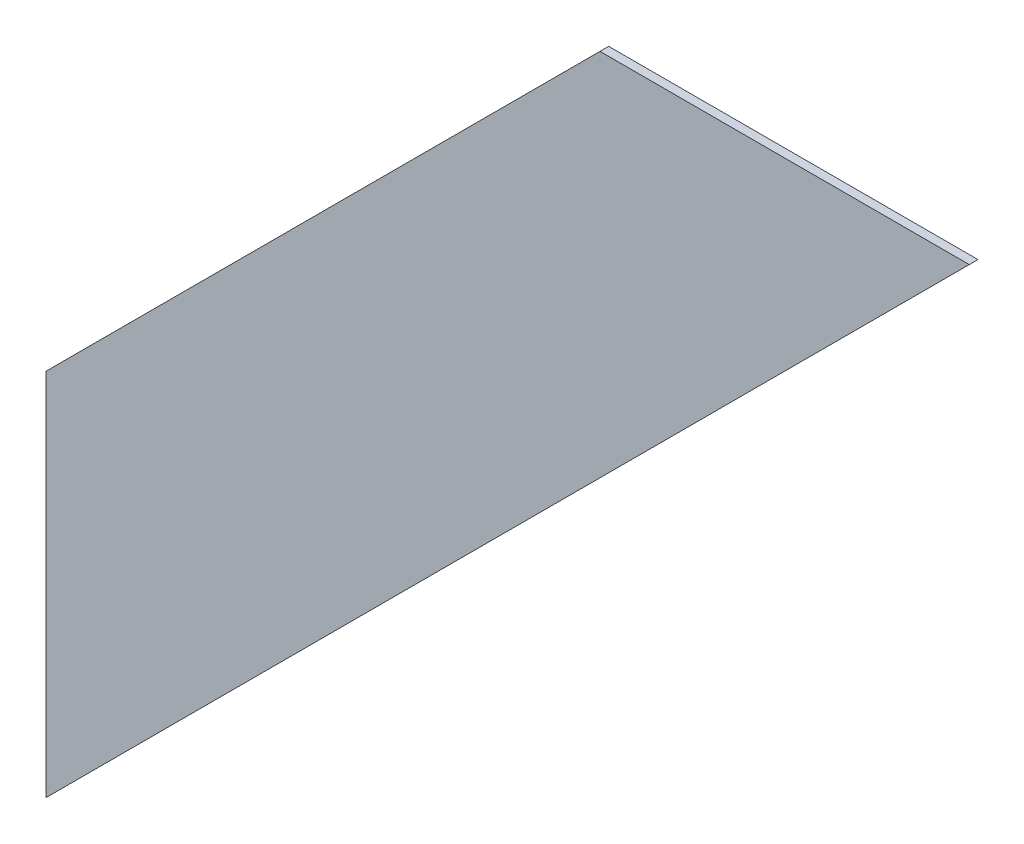
ISO-10303-21;
HEADER;
FILE_DESCRIPTION(('STEP AP214'),'2;1');
FILE_NAME('part.step','',(''),(''),'','','');
FILE_SCHEMA(('AUTOMOTIVE_DESIGN { 1 0 10303 214 1 1 1 1 }'));
ENDSEC;
DATA;
#1=APPLICATION_CONTEXT('core data for automotive mechanical design processes');
#2=APPLICATION_PROTOCOL_DEFINITION('international standard','automotive_design',2000,#1);
#3=PRODUCT_CONTEXT('',#1,'mechanical');
#4=PRODUCT('Part','Part','',(#3));
#5=PRODUCT_RELATED_PRODUCT_CATEGORY('part','',(#4));
#6=PRODUCT_DEFINITION_FORMATION('','',#4);
#7=PRODUCT_DEFINITION_CONTEXT('part definition',#1,'design');
#8=PRODUCT_DEFINITION('design','',#6,#7);
#9=PRODUCT_DEFINITION_SHAPE('','',#8);
#10=(LENGTH_UNIT() NAMED_UNIT(*) SI_UNIT(.MILLI.,.METRE.));
#11=(NAMED_UNIT(*) PLANE_ANGLE_UNIT() SI_UNIT($,.RADIAN.));
#12=(NAMED_UNIT(*) SI_UNIT($,.STERADIAN.) SOLID_ANGLE_UNIT());
#13=UNCERTAINTY_MEASURE_WITH_UNIT(LENGTH_MEASURE(1.E-05),#10,'distance_accuracy_value','');
#14=(GEOMETRIC_REPRESENTATION_CONTEXT(3) GLOBAL_UNCERTAINTY_ASSIGNED_CONTEXT((#13)) GLOBAL_UNIT_ASSIGNED_CONTEXT((#10,
#11,#12)) REPRESENTATION_CONTEXT('',''));
#15=CARTESIAN_POINT('',(0.,0.,0.));
#16=DIRECTION('',(0.,0.,1.));
#17=DIRECTION('',(1.,0.,0.));
#18=AXIS2_PLACEMENT_3D('',#15,#16,#17);
#19=CARTESIAN_POINT('',(0.,25.9872556294998,1.));
#20=DIRECTION('',(0.,1.,0.));
#21=DIRECTION('',(0.,0.,1.));
#22=AXIS2_PLACEMENT_3D('',#19,#20,#21);
#23=PLANE('',#22);
#24=DIRECTION('',(1.,0.,0.));
#25=VECTOR('',#24,1.);
#26=CARTESIAN_POINT('',(0.,25.9872556294998,0.));
#27=LINE('',#26,#25);
#28=CARTESIAN_POINT('',(34.188548182821,25.9872556294998,0.));
#29=VERTEX_POINT('',#28);
#30=CARTESIAN_POINT('',(76.6149550540138,25.9872556294998,0.));
#31=VERTEX_POINT('',#30);
#32=EDGE_CURVE('E97',#29,#31,#27,.T.);
#33=ORIENTED_EDGE('',*,*,#32,.F.);
#34=DIRECTION('',(0.,0.,-1.));
#35=VECTOR('',#34,1.);
#36=CARTESIAN_POINT('',(34.188548182821,25.9872556294998,1.));
#37=LINE('',#36,#35);
#38=CARTESIAN_POINT('',(34.188548182821,25.9872556294998,1.));
#39=VERTEX_POINT('',#38);
#40=EDGE_CURVE('E11',#39,#29,#37,.T.);
#41=ORIENTED_EDGE('',*,*,#40,.F.);
#42=DIRECTION('',(1.,0.,0.));
#43=VECTOR('',#42,1.);
#44=CARTESIAN_POINT('',(0.,25.9872556294998,1.));
#45=LINE('',#44,#43);
#46=CARTESIAN_POINT('',(76.6149550540138,25.9872556294998,1.));
#47=VERTEX_POINT('',#46);
#48=EDGE_CURVE('E82',#39,#47,#45,.T.);
#49=ORIENTED_EDGE('',*,*,#48,.T.);
#50=DIRECTION('',(0.,0.,-1.));
#51=VECTOR('',#50,1.);
#52=CARTESIAN_POINT('',(76.6149550540138,25.9872556294998,1.));
#53=LINE('',#52,#51);
#54=EDGE_CURVE('E50',#47,#31,#53,.T.);
#55=ORIENTED_EDGE('',*,*,#54,.T.);
#56=EDGE_LOOP('',(#33,#41,#49,#55));
#57=FACE_BOUND('',#56,.T.);
#58=ADVANCED_FACE('F34',(#57),#23,.T.);
#59=CARTESIAN_POINT('',(4.10064627666059,-4.10064627666059,1.));
#60=DIRECTION('',(0.707106781186547,-0.707106781186547,0.));
#61=DIRECTION('',(0.707106781186548,0.707106781186548,0.));
#62=AXIS2_PLACEMENT_3D('',#59,#60,#61);
#63=PLANE('',#62);
#64=DIRECTION('',(-0.707106781186548,-0.707106781186548,0.));
#65=VECTOR('',#64,1.);
#66=CARTESIAN_POINT('',(4.10064627666059,-4.10064627666059,0.));
#67=LINE('',#66,#65);
#68=CARTESIAN_POINT('',(-29.4510621239683,-37.6523546772894,0.));
#69=VERTEX_POINT('',#68);
#70=EDGE_CURVE('E88',#29,#69,#67,.T.);
#71=ORIENTED_EDGE('',*,*,#70,.T.);
#72=DIRECTION('',(0.,0.,-1.));
#73=VECTOR('',#72,1.);
#74=CARTESIAN_POINT('',(-29.4510621239683,-37.6523546772894,1.));
#75=LINE('',#74,#73);
#76=CARTESIAN_POINT('',(-29.4510621239683,-37.6523546772894,1.));
#77=VERTEX_POINT('',#76);
#78=EDGE_CURVE('E42',#77,#69,#75,.T.);
#79=ORIENTED_EDGE('',*,*,#78,.F.);
#80=DIRECTION('',(-0.707106781186548,-0.707106781186548,0.));
#81=VECTOR('',#80,1.);
#82=CARTESIAN_POINT('',(4.10064627666059,-4.10064627666059,1.));
#83=LINE('',#82,#81);
#84=EDGE_CURVE('E76',#39,#77,#83,.T.);
#85=ORIENTED_EDGE('',*,*,#84,.F.);
#86=ORIENTED_EDGE('',*,*,#40,.T.);
#87=EDGE_LOOP('',(#71,#79,#85,#86));
#88=FACE_BOUND('',#87,.T.);
#89=ADVANCED_FACE('F86',(#88),#63,.F.);
#90=CARTESIAN_POINT('',(-29.4510621239683,0.,1.));
#91=DIRECTION('',(-1.,0.,0.));
#92=DIRECTION('',(0.,0.,1.));
#93=AXIS2_PLACEMENT_3D('',#90,#91,#92);
#94=PLANE('',#93);
#95=DIRECTION('',(0.,1.,0.));
#96=VECTOR('',#95,1.);
#97=CARTESIAN_POINT('',(-29.4510621239683,0.,0.));
#98=LINE('',#97,#96);
#99=CARTESIAN_POINT('',(-29.4510621239683,-80.0787615484823,0.));
#100=VERTEX_POINT('',#99);
#101=EDGE_CURVE('E100',#100,#69,#98,.T.);
#102=ORIENTED_EDGE('',*,*,#101,.F.);
#103=DIRECTION('',(0.,0.,-1.));
#104=VECTOR('',#103,1.);
#105=CARTESIAN_POINT('',(-29.4510621239683,-80.0787615484823,1.));
#106=LINE('',#105,#104);
#107=CARTESIAN_POINT('',(-29.4510621239683,-80.0787615484823,1.));
#108=VERTEX_POINT('',#107);
#109=EDGE_CURVE('E63',#108,#100,#106,.T.);
#110=ORIENTED_EDGE('',*,*,#109,.F.);
#111=DIRECTION('',(0.,1.,0.));
#112=VECTOR('',#111,1.);
#113=CARTESIAN_POINT('',(-29.4510621239683,0.,1.));
#114=LINE('',#113,#112);
#115=EDGE_CURVE('E81',#108,#77,#114,.T.);
#116=ORIENTED_EDGE('',*,*,#115,.T.);
#117=ORIENTED_EDGE('',*,*,#78,.T.);
#118=EDGE_LOOP('',(#102,#110,#116,#117));
#119=FACE_BOUND('',#118,.T.);
#120=ADVANCED_FACE('F91',(#119),#94,.T.);
#121=CARTESIAN_POINT('',(25.313849712257,-25.313849712257,1.));
#122=DIRECTION('',(0.707106781186547,-0.707106781186547,0.));
#123=DIRECTION('',(0.707106781186548,0.707106781186548,0.));
#124=AXIS2_PLACEMENT_3D('',#121,#122,#123);
#125=PLANE('',#124);
#126=DIRECTION('',(-0.707106781186548,-0.707106781186548,0.));
#127=VECTOR('',#126,1.);
#128=CARTESIAN_POINT('',(25.313849712257,-25.313849712257,0.));
#129=LINE('',#128,#127);
#130=EDGE_CURVE('E102',#31,#100,#129,.T.);
#131=ORIENTED_EDGE('',*,*,#130,.F.);
#132=ORIENTED_EDGE('',*,*,#54,.F.);
#133=DIRECTION('',(-0.707106781186548,-0.707106781186548,0.));
#134=VECTOR('',#133,1.);
#135=CARTESIAN_POINT('',(25.313849712257,-25.313849712257,1.));
#136=LINE('',#135,#134);
#137=EDGE_CURVE('E92',#47,#108,#136,.T.);
#138=ORIENTED_EDGE('',*,*,#137,.T.);
#139=ORIENTED_EDGE('',*,*,#109,.T.);
#140=EDGE_LOOP('',(#131,#132,#138,#139));
#141=FACE_BOUND('',#140,.T.);
#142=ADVANCED_FACE('F107',(#141),#125,.T.);
#143=CARTESIAN_POINT('',(0.,0.,1.));
#144=DIRECTION('',(0.,0.,1.));
#145=DIRECTION('',(1.,0.,0.));
#146=AXIS2_PLACEMENT_3D('',#143,#144,#145);
#147=PLANE('',#146);
#148=ORIENTED_EDGE('',*,*,#48,.F.);
#149=ORIENTED_EDGE('',*,*,#84,.T.);
#150=ORIENTED_EDGE('',*,*,#115,.F.);
#151=ORIENTED_EDGE('',*,*,#137,.F.);
#152=EDGE_LOOP('',(#148,#149,#150,#151));
#153=FACE_BOUND('',#152,.T.);
#154=ADVANCED_FACE('F78',(#153),#147,.T.);
#155=CARTESIAN_POINT('',(0.,0.,0.));
#156=DIRECTION('',(0.,0.,1.));
#157=DIRECTION('',(1.,0.,0.));
#158=AXIS2_PLACEMENT_3D('',#155,#156,#157);
#159=PLANE('',#158);
#160=ORIENTED_EDGE('',*,*,#32,.T.);
#161=ORIENTED_EDGE('',*,*,#130,.T.);
#162=ORIENTED_EDGE('',*,*,#101,.T.);
#163=ORIENTED_EDGE('',*,*,#70,.F.);
#164=EDGE_LOOP('',(#160,#161,#162,#163));
#165=FACE_BOUND('',#164,.T.);
#166=ADVANCED_FACE('F114',(#165),#159,.F.);
#167=CLOSED_SHELL('',(#58,#89,#120,#142,#154,#166));
#168=MANIFOLD_SOLID_BREP('B2',#167);
#169=ADVANCED_BREP_SHAPE_REPRESENTATION('',(#18,#168),#14);
#170=SHAPE_DEFINITION_REPRESENTATION(#9,#169);
ENDSEC;
END-ISO-10303-21;
